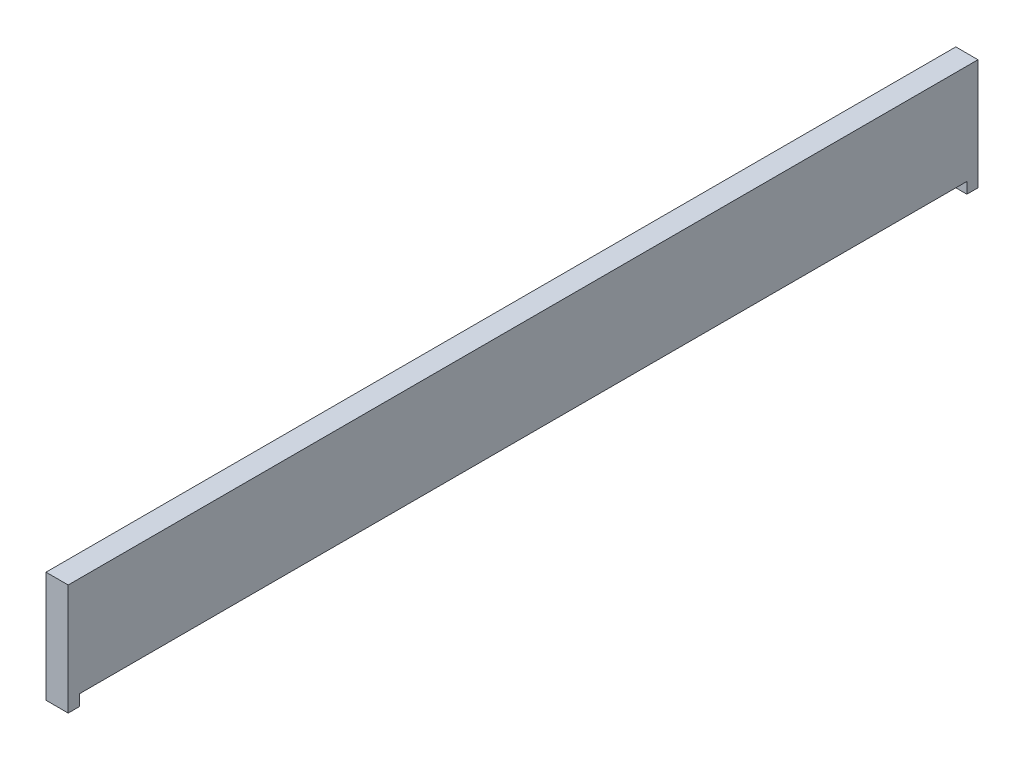
ISO-10303-21;
HEADER;
FILE_DESCRIPTION(('STEP AP214'),'2;1');
FILE_NAME('part.step','',(''),(''),'','','');
FILE_SCHEMA(('AUTOMOTIVE_DESIGN { 1 0 10303 214 1 1 1 1 }'));
ENDSEC;
DATA;
#1=APPLICATION_CONTEXT('core data for automotive mechanical design processes');
#2=APPLICATION_PROTOCOL_DEFINITION('international standard','automotive_design',2000,#1);
#3=PRODUCT_CONTEXT('',#1,'mechanical');
#4=PRODUCT('Part','Part','',(#3));
#5=PRODUCT_RELATED_PRODUCT_CATEGORY('part','',(#4));
#6=PRODUCT_DEFINITION_FORMATION('','',#4);
#7=PRODUCT_DEFINITION_CONTEXT('part definition',#1,'design');
#8=PRODUCT_DEFINITION('design','',#6,#7);
#9=PRODUCT_DEFINITION_SHAPE('','',#8);
#10=(LENGTH_UNIT() NAMED_UNIT(*) SI_UNIT(.MILLI.,.METRE.));
#11=(NAMED_UNIT(*) PLANE_ANGLE_UNIT() SI_UNIT($,.RADIAN.));
#12=(NAMED_UNIT(*) SI_UNIT($,.STERADIAN.) SOLID_ANGLE_UNIT());
#13=UNCERTAINTY_MEASURE_WITH_UNIT(LENGTH_MEASURE(1.E-05),#10,'distance_accuracy_value','');
#14=(GEOMETRIC_REPRESENTATION_CONTEXT(3) GLOBAL_UNCERTAINTY_ASSIGNED_CONTEXT((#13)) GLOBAL_UNIT_ASSIGNED_CONTEXT((#10,
#11,#12)) REPRESENTATION_CONTEXT('',''));
#15=CARTESIAN_POINT('',(0.,0.,0.));
#16=DIRECTION('',(0.,0.,1.));
#17=DIRECTION('',(1.,0.,0.));
#18=AXIS2_PLACEMENT_3D('',#15,#16,#17);
#19=CARTESIAN_POINT('',(10.,10.,820.));
#20=DIRECTION('',(-1.,0.,0.));
#21=DIRECTION('',(0.,-1.,0.));
#22=AXIS2_PLACEMENT_3D('',#19,#20,#21);
#23=PLANE('',#22);
#24=DIRECTION('',(0.,-1.,0.));
#25=VECTOR('',#24,1.);
#26=CARTESIAN_POINT('',(10.,0.,10.0000000000002));
#27=LINE('',#26,#25);
#28=CARTESIAN_POINT('',(10.,10.,10.0000000000005));
#29=VERTEX_POINT('',#28);
#30=CARTESIAN_POINT('',(10.,0.,10.0000000000005));
#31=VERTEX_POINT('',#30);
#32=EDGE_CURVE('E46',#29,#31,#27,.T.);
#33=ORIENTED_EDGE('',*,*,#32,.F.);
#34=DIRECTION('',(0.,0.,-1.));
#35=VECTOR('',#34,1.);
#36=CARTESIAN_POINT('',(10.,10.,820.));
#37=LINE('',#36,#35);
#38=CARTESIAN_POINT('',(10.,10.,810.));
#39=VERTEX_POINT('',#38);
#40=EDGE_CURVE('E40',#39,#29,#37,.T.);
#41=ORIENTED_EDGE('',*,*,#40,.F.);
#42=DIRECTION('',(0.,1.,0.));
#43=VECTOR('',#42,1.);
#44=CARTESIAN_POINT('',(10.,0.,810.));
#45=LINE('',#44,#43);
#46=CARTESIAN_POINT('',(10.,0.,810.));
#47=VERTEX_POINT('',#46);
#48=EDGE_CURVE('E130',#47,#39,#45,.T.);
#49=ORIENTED_EDGE('',*,*,#48,.F.);
#50=DIRECTION('',(0.,0.,-1.));
#51=VECTOR('',#50,1.);
#52=CARTESIAN_POINT('',(10.,0.,820.));
#53=LINE('',#52,#51);
#54=EDGE_CURVE('E11',#47,#31,#53,.T.);
#55=ORIENTED_EDGE('',*,*,#54,.T.);
#56=EDGE_LOOP('',(#33,#41,#49,#55));
#57=FACE_BOUND('',#56,.T.);
#58=ADVANCED_FACE('F32',(#57),#23,.F.);
#59=CARTESIAN_POINT('',(20.,10.,820.));
#60=DIRECTION('',(0.,1.,0.));
#61=DIRECTION('',(0.,0.,1.));
#62=AXIS2_PLACEMENT_3D('',#59,#60,#61);
#63=PLANE('',#62);
#64=DIRECTION('',(-1.,0.,0.));
#65=VECTOR('',#64,1.);
#66=CARTESIAN_POINT('',(20.,10.,10.0000000000002));
#67=LINE('',#66,#65);
#68=CARTESIAN_POINT('',(20.,10.,10.0000000000005));
#69=VERTEX_POINT('',#68);
#70=EDGE_CURVE('E127',#69,#29,#67,.T.);
#71=ORIENTED_EDGE('',*,*,#70,.F.);
#72=DIRECTION('',(0.,0.,-1.));
#73=VECTOR('',#72,1.);
#74=CARTESIAN_POINT('',(20.,10.,820.));
#75=LINE('',#74,#73);
#76=CARTESIAN_POINT('',(20.,10.,810.));
#77=VERTEX_POINT('',#76);
#78=EDGE_CURVE('E158',#77,#69,#75,.T.);
#79=ORIENTED_EDGE('',*,*,#78,.F.);
#80=DIRECTION('',(-1.,0.,0.));
#81=VECTOR('',#80,1.);
#82=CARTESIAN_POINT('',(20.,10.,810.));
#83=LINE('',#82,#81);
#84=EDGE_CURVE('E135',#77,#39,#83,.T.);
#85=ORIENTED_EDGE('',*,*,#84,.T.);
#86=ORIENTED_EDGE('',*,*,#40,.T.);
#87=EDGE_LOOP('',(#71,#79,#85,#86));
#88=FACE_BOUND('',#87,.T.);
#89=ADVANCED_FACE('F160',(#88),#63,.F.);
#90=CARTESIAN_POINT('',(10.,0.,820.));
#91=DIRECTION('',(0.,1.,0.));
#92=DIRECTION('',(-1.,0.,0.));
#93=AXIS2_PLACEMENT_3D('',#90,#91,#92);
#94=PLANE('',#93);
#95=DIRECTION('',(1.,0.,0.));
#96=VECTOR('',#95,1.);
#97=CARTESIAN_POINT('',(10.,0.,0.));
#98=LINE('',#97,#96);
#99=CARTESIAN_POINT('',(0.,0.,0.));
#100=VERTEX_POINT('',#99);
#101=CARTESIAN_POINT('',(20.,0.,2.22044604925031E-13));
#102=VERTEX_POINT('',#101);
#103=EDGE_CURVE('E99',#100,#102,#98,.T.);
#104=ORIENTED_EDGE('',*,*,#103,.T.);
#105=DIRECTION('',(0.,0.,-1.));
#106=VECTOR('',#105,1.);
#107=CARTESIAN_POINT('',(20.,0.,2.22044604925031E-13));
#108=LINE('',#107,#106);
#109=CARTESIAN_POINT('',(20.,0.,10.0000000000002));
#110=VERTEX_POINT('',#109);
#111=EDGE_CURVE('E110',#110,#102,#108,.T.);
#112=ORIENTED_EDGE('',*,*,#111,.F.);
#113=DIRECTION('',(-1.,0.,0.));
#114=VECTOR('',#113,1.);
#115=CARTESIAN_POINT('',(20.,0.,10.0000000000002));
#116=LINE('',#115,#114);
#117=EDGE_CURVE('E122',#110,#31,#116,.T.);
#118=ORIENTED_EDGE('',*,*,#117,.T.);
#119=ORIENTED_EDGE('',*,*,#54,.F.);
#120=DIRECTION('',(-1.,0.,0.));
#121=VECTOR('',#120,1.);
#122=CARTESIAN_POINT('',(20.,0.,810.));
#123=LINE('',#122,#121);
#124=CARTESIAN_POINT('',(20.,0.,810.));
#125=VERTEX_POINT('',#124);
#126=EDGE_CURVE('E114',#125,#47,#123,.T.);
#127=ORIENTED_EDGE('',*,*,#126,.F.);
#128=DIRECTION('',(0.,0.,-1.));
#129=VECTOR('',#128,1.);
#130=CARTESIAN_POINT('',(20.,0.,820.));
#131=LINE('',#130,#129);
#132=CARTESIAN_POINT('',(20.,0.,820.));
#133=VERTEX_POINT('',#132);
#134=EDGE_CURVE('E131',#133,#125,#131,.T.);
#135=ORIENTED_EDGE('',*,*,#134,.F.);
#136=DIRECTION('',(1.,0.,0.));
#137=VECTOR('',#136,1.);
#138=CARTESIAN_POINT('',(10.,0.,820.));
#139=LINE('',#138,#137);
#140=CARTESIAN_POINT('',(0.,0.,820.));
#141=VERTEX_POINT('',#140);
#142=EDGE_CURVE('E140',#141,#133,#139,.T.);
#143=ORIENTED_EDGE('',*,*,#142,.F.);
#144=DIRECTION('',(0.,0.,-1.));
#145=VECTOR('',#144,1.);
#146=CARTESIAN_POINT('',(0.,0.,820.));
#147=LINE('',#146,#145);
#148=EDGE_CURVE('E113',#141,#100,#147,.T.);
#149=ORIENTED_EDGE('',*,*,#148,.T.);
#150=EDGE_LOOP('',(#104,#112,#118,#119,#127,#135,#143,#149));
#151=FACE_BOUND('',#150,.T.);
#152=ADVANCED_FACE('F34',(#151),#94,.F.);
#153=CARTESIAN_POINT('',(20.,100.,820.));
#154=DIRECTION('',(-1.,0.,0.));
#155=DIRECTION('',(0.,-1.,0.));
#156=AXIS2_PLACEMENT_3D('',#153,#154,#155);
#157=PLANE('',#156);
#158=DIRECTION('',(0.,1.,0.));
#159=VECTOR('',#158,1.);
#160=CARTESIAN_POINT('',(20.,100.,0.));
#161=LINE('',#160,#159);
#162=CARTESIAN_POINT('',(20.,100.,0.));
#163=VERTEX_POINT('',#162);
#164=EDGE_CURVE('E95',#102,#163,#161,.T.);
#165=ORIENTED_EDGE('',*,*,#164,.T.);
#166=DIRECTION('',(0.,0.,-1.));
#167=VECTOR('',#166,1.);
#168=CARTESIAN_POINT('',(20.,100.,820.));
#169=LINE('',#168,#167);
#170=CARTESIAN_POINT('',(20.,100.,820.));
#171=VERTEX_POINT('',#170);
#172=EDGE_CURVE('E156',#171,#163,#169,.T.);
#173=ORIENTED_EDGE('',*,*,#172,.F.);
#174=DIRECTION('',(0.,1.,0.));
#175=VECTOR('',#174,1.);
#176=CARTESIAN_POINT('',(20.,100.,820.));
#177=LINE('',#176,#175);
#178=EDGE_CURVE('E143',#133,#171,#177,.T.);
#179=ORIENTED_EDGE('',*,*,#178,.F.);
#180=ORIENTED_EDGE('',*,*,#134,.T.);
#181=DIRECTION('',(0.,1.,0.));
#182=VECTOR('',#181,1.);
#183=CARTESIAN_POINT('',(20.,0.,810.));
#184=LINE('',#183,#182);
#185=EDGE_CURVE('E133',#125,#77,#184,.T.);
#186=ORIENTED_EDGE('',*,*,#185,.T.);
#187=ORIENTED_EDGE('',*,*,#78,.T.);
#188=DIRECTION('',(0.,-1.,0.));
#189=VECTOR('',#188,1.);
#190=CARTESIAN_POINT('',(20.,0.,10.0000000000002));
#191=LINE('',#190,#189);
#192=EDGE_CURVE('E119',#69,#110,#191,.T.);
#193=ORIENTED_EDGE('',*,*,#192,.T.);
#194=ORIENTED_EDGE('',*,*,#111,.T.);
#195=EDGE_LOOP('',(#165,#173,#179,#180,#186,#187,#193,#194));
#196=FACE_BOUND('',#195,.T.);
#197=ADVANCED_FACE('F116',(#196),#157,.F.);
#198=CARTESIAN_POINT('',(0.,100.,820.));
#199=DIRECTION('',(0.,-1.,0.));
#200=DIRECTION('',(0.,0.,-1.));
#201=AXIS2_PLACEMENT_3D('',#198,#199,#200);
#202=PLANE('',#201);
#203=DIRECTION('',(-1.,0.,0.));
#204=VECTOR('',#203,1.);
#205=CARTESIAN_POINT('',(0.,100.,0.));
#206=LINE('',#205,#204);
#207=CARTESIAN_POINT('',(0.,100.,0.));
#208=VERTEX_POINT('',#207);
#209=EDGE_CURVE('E100',#163,#208,#206,.T.);
#210=ORIENTED_EDGE('',*,*,#209,.T.);
#211=DIRECTION('',(0.,0.,-1.));
#212=VECTOR('',#211,1.);
#213=CARTESIAN_POINT('',(0.,100.,820.));
#214=LINE('',#213,#212);
#215=CARTESIAN_POINT('',(0.,100.,820.));
#216=VERTEX_POINT('',#215);
#217=EDGE_CURVE('E153',#216,#208,#214,.T.);
#218=ORIENTED_EDGE('',*,*,#217,.F.);
#219=DIRECTION('',(-1.,0.,0.));
#220=VECTOR('',#219,1.);
#221=CARTESIAN_POINT('',(0.,100.,820.));
#222=LINE('',#221,#220);
#223=EDGE_CURVE('E146',#171,#216,#222,.T.);
#224=ORIENTED_EDGE('',*,*,#223,.F.);
#225=ORIENTED_EDGE('',*,*,#172,.T.);
#226=EDGE_LOOP('',(#210,#218,#224,#225));
#227=FACE_BOUND('',#226,.T.);
#228=ADVANCED_FACE('F178',(#227),#202,.F.);
#229=CARTESIAN_POINT('',(0.,0.,820.));
#230=DIRECTION('',(1.,0.,0.));
#231=DIRECTION('',(0.,1.,0.));
#232=AXIS2_PLACEMENT_3D('',#229,#230,#231);
#233=PLANE('',#232);
#234=DIRECTION('',(0.,-1.,0.));
#235=VECTOR('',#234,1.);
#236=CARTESIAN_POINT('',(0.,0.,0.));
#237=LINE('',#236,#235);
#238=EDGE_CURVE('E144',#208,#100,#237,.T.);
#239=ORIENTED_EDGE('',*,*,#238,.T.);
#240=ORIENTED_EDGE('',*,*,#148,.F.);
#241=DIRECTION('',(0.,-1.,0.));
#242=VECTOR('',#241,1.);
#243=CARTESIAN_POINT('',(0.,0.,820.));
#244=LINE('',#243,#242);
#245=EDGE_CURVE('E148',#216,#141,#244,.T.);
#246=ORIENTED_EDGE('',*,*,#245,.F.);
#247=ORIENTED_EDGE('',*,*,#217,.T.);
#248=EDGE_LOOP('',(#239,#240,#246,#247));
#249=FACE_BOUND('',#248,.T.);
#250=ADVANCED_FACE('F176',(#249),#233,.F.);
#251=CARTESIAN_POINT('',(0.,0.,820.));
#252=DIRECTION('',(0.,0.,-1.));
#253=DIRECTION('',(-1.,0.,0.));
#254=AXIS2_PLACEMENT_3D('',#251,#252,#253);
#255=PLANE('',#254);
#256=ORIENTED_EDGE('',*,*,#142,.T.);
#257=ORIENTED_EDGE('',*,*,#178,.T.);
#258=ORIENTED_EDGE('',*,*,#223,.T.);
#259=ORIENTED_EDGE('',*,*,#245,.T.);
#260=EDGE_LOOP('',(#256,#257,#258,#259));
#261=FACE_BOUND('',#260,.T.);
#262=ADVANCED_FACE('F172',(#261),#255,.F.);
#263=CARTESIAN_POINT('',(0.,0.,0.));
#264=DIRECTION('',(0.,0.,-1.));
#265=DIRECTION('',(-1.,0.,0.));
#266=AXIS2_PLACEMENT_3D('',#263,#264,#265);
#267=PLANE('',#266);
#268=ORIENTED_EDGE('',*,*,#164,.F.);
#269=ORIENTED_EDGE('',*,*,#103,.F.);
#270=ORIENTED_EDGE('',*,*,#238,.F.);
#271=ORIENTED_EDGE('',*,*,#209,.F.);
#272=EDGE_LOOP('',(#268,#269,#270,#271));
#273=FACE_BOUND('',#272,.T.);
#274=ADVANCED_FACE('F97',(#273),#267,.T.);
#275=CARTESIAN_POINT('',(20.,0.,810.));
#276=DIRECTION('',(0.,0.,1.));
#277=DIRECTION('',(1.,0.,0.));
#278=AXIS2_PLACEMENT_3D('',#275,#276,#277);
#279=PLANE('',#278);
#280=ORIENTED_EDGE('',*,*,#48,.T.);
#281=ORIENTED_EDGE('',*,*,#84,.F.);
#282=ORIENTED_EDGE('',*,*,#185,.F.);
#283=ORIENTED_EDGE('',*,*,#126,.T.);
#284=EDGE_LOOP('',(#280,#281,#282,#283));
#285=FACE_BOUND('',#284,.T.);
#286=ADVANCED_FACE('F169',(#285),#279,.F.);
#287=CARTESIAN_POINT('',(20.,0.,10.0000000000002));
#288=DIRECTION('',(0.,0.,-1.));
#289=DIRECTION('',(-1.,0.,0.));
#290=AXIS2_PLACEMENT_3D('',#287,#288,#289);
#291=PLANE('',#290);
#292=ORIENTED_EDGE('',*,*,#32,.T.);
#293=ORIENTED_EDGE('',*,*,#117,.F.);
#294=ORIENTED_EDGE('',*,*,#192,.F.);
#295=ORIENTED_EDGE('',*,*,#70,.T.);
#296=EDGE_LOOP('',(#292,#293,#294,#295));
#297=FACE_BOUND('',#296,.T.);
#298=ADVANCED_FACE('F164',(#297),#291,.F.);
#299=CLOSED_SHELL('',(#58,#89,#152,#197,#228,#250,#262,#274,#286,#298));
#300=MANIFOLD_SOLID_BREP('B2',#299);
#301=ADVANCED_BREP_SHAPE_REPRESENTATION('',(#18,#300),#14);
#302=SHAPE_DEFINITION_REPRESENTATION(#9,#301);
ENDSEC;
END-ISO-10303-21;
